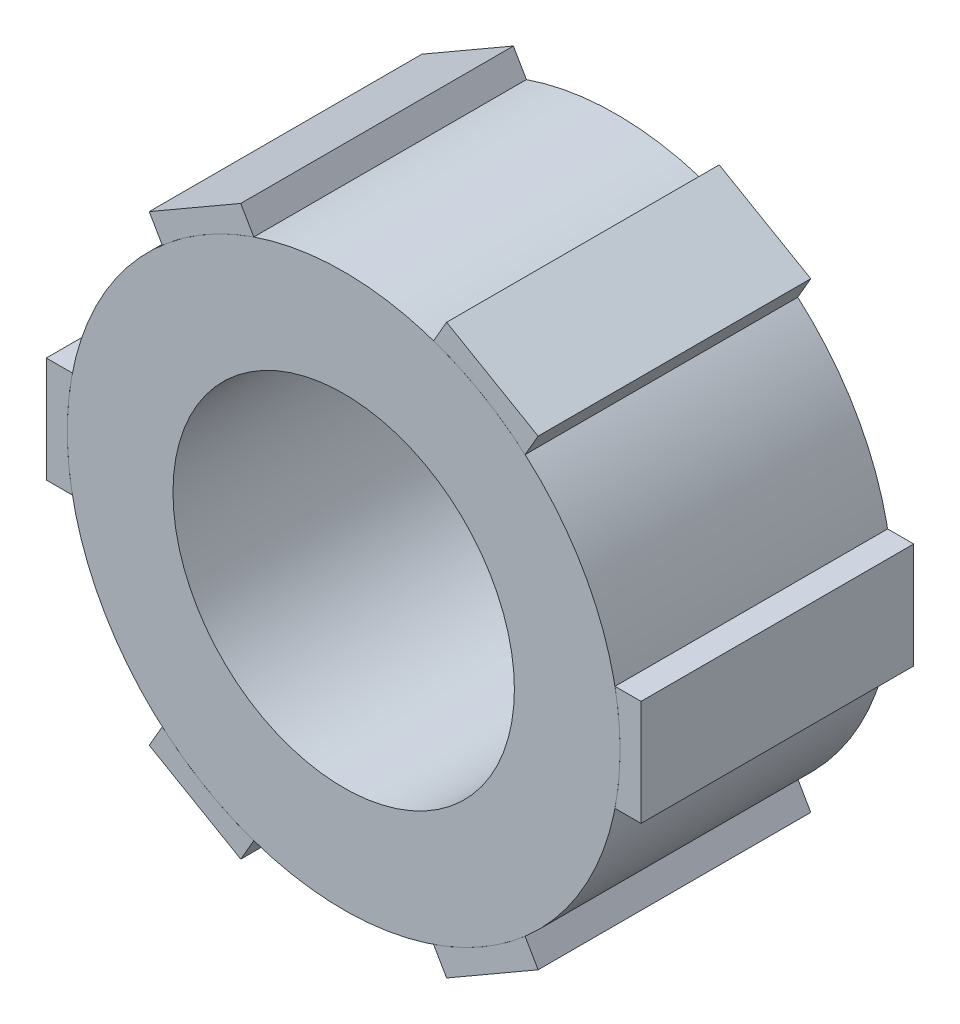
ISO-10303-21;
HEADER;
FILE_DESCRIPTION(('STEP AP214'),'2;1');
FILE_NAME('part.step','',(''),(''),'','','');
FILE_SCHEMA(('AUTOMOTIVE_DESIGN { 1 0 10303 214 1 1 1 1 }'));
ENDSEC;
DATA;
#1=APPLICATION_CONTEXT('core data for automotive mechanical design processes');
#2=APPLICATION_PROTOCOL_DEFINITION('international standard','automotive_design',2000,#1);
#3=PRODUCT_CONTEXT('',#1,'mechanical');
#4=PRODUCT('Part','Part','',(#3));
#5=PRODUCT_RELATED_PRODUCT_CATEGORY('part','',(#4));
#6=PRODUCT_DEFINITION_FORMATION('','',#4);
#7=PRODUCT_DEFINITION_CONTEXT('part definition',#1,'design');
#8=PRODUCT_DEFINITION('design','',#6,#7);
#9=PRODUCT_DEFINITION_SHAPE('','',#8);
#10=(LENGTH_UNIT() NAMED_UNIT(*) SI_UNIT(.MILLI.,.METRE.));
#11=(NAMED_UNIT(*) PLANE_ANGLE_UNIT() SI_UNIT($,.RADIAN.));
#12=(NAMED_UNIT(*) SI_UNIT($,.STERADIAN.) SOLID_ANGLE_UNIT());
#13=UNCERTAINTY_MEASURE_WITH_UNIT(LENGTH_MEASURE(1.E-05),#10,'distance_accuracy_value','');
#14=(GEOMETRIC_REPRESENTATION_CONTEXT(3) GLOBAL_UNCERTAINTY_ASSIGNED_CONTEXT((#13)) GLOBAL_UNIT_ASSIGNED_CONTEXT((#10,
#11,#12)) REPRESENTATION_CONTEXT('',''));
#15=CARTESIAN_POINT('',(0.,0.,0.));
#16=DIRECTION('',(0.,0.,1.));
#17=DIRECTION('',(1.,0.,0.));
#18=AXIS2_PLACEMENT_3D('',#15,#16,#17);
#19=CARTESIAN_POINT('',(0.,0.,-3.59829421058804));
#20=DIRECTION('',(0.,0.,1.));
#21=DIRECTION('',(1.,0.,0.));
#22=AXIS2_PLACEMENT_3D('',#19,#20,#21);
#23=CYLINDRICAL_SURFACE('',#22,7.715);
#24=DIRECTION('',(0.,0.,1.));
#25=VECTOR('',#24,1.);
#26=CARTESIAN_POINT('',(-2.50895641237421,-7.29563998020779,-3.59829421058804));
#27=LINE('',#26,#25);
#28=CARTESIAN_POINT('',(-2.50895641237421,-7.29563998020779,0.));
#29=VERTEX_POINT('',#28);
#30=CARTESIAN_POINT('',(-2.50895641237421,-7.29563998020779,7.61));
#31=VERTEX_POINT('',#30);
#32=EDGE_CURVE('E120',#29,#31,#27,.T.);
#33=ORIENTED_EDGE('',*,*,#32,.F.);
#34=CARTESIAN_POINT('',(0.,0.,0.));
#35=DIRECTION('',(0.,0.,1.));
#36=DIRECTION('',(1.,0.,0.));
#37=AXIS2_PLACEMENT_3D('',#34,#35,#36);
#38=CIRCLE('',#37,7.715);
#39=CARTESIAN_POINT('',(-5.0637313535383,-5.82063998020778,0.));
#40=VERTEX_POINT('',#39);
#41=EDGE_CURVE('E65',#29,#40,#38,.F.);
#42=ORIENTED_EDGE('',*,*,#41,.T.);
#43=DIRECTION('',(0.,0.,1.));
#44=VECTOR('',#43,1.);
#45=CARTESIAN_POINT('',(-5.0637313535383,-5.82063998020778,-3.59829421058804));
#46=LINE('',#45,#44);
#47=CARTESIAN_POINT('',(-5.0637313535383,-5.82063998020778,7.61));
#48=VERTEX_POINT('',#47);
#49=EDGE_CURVE('E95',#40,#48,#46,.T.);
#50=ORIENTED_EDGE('',*,*,#49,.T.);
#51=CARTESIAN_POINT('',(0.,0.,7.61));
#52=DIRECTION('',(0.,0.,1.));
#53=DIRECTION('',(1.,0.,0.));
#54=AXIS2_PLACEMENT_3D('',#51,#52,#53);
#55=CIRCLE('',#54,7.715);
#56=EDGE_CURVE('E98',#48,#31,#55,.T.);
#57=ORIENTED_EDGE('',*,*,#56,.T.);
#58=EDGE_LOOP('',(#33,#42,#50,#57));
#59=FACE_BOUND('',#58,.T.);
#60=ADVANCED_FACE('F58',(#59),#23,.F.);
#61=CARTESIAN_POINT('',(1.27738747058204,-0.737500000000006,-3.59829421058804));
#62=DIRECTION('',(-0.866025403784436,0.500000000000004,0.));
#63=DIRECTION('',(-0.500000000000004,-0.866025403784436,0.));
#64=AXIS2_PLACEMENT_3D('',#61,#62,#63);
#65=PLANE('',#64);
#66=DIRECTION('',(0.,0.,1.));
#67=VECTOR('',#66,1.);
#68=CARTESIAN_POINT('',(-2.87261252941799,-7.92551085141083,-3.59829421058804));
#69=LINE('',#68,#67);
#70=CARTESIAN_POINT('',(-2.87261252941799,-7.92551085141083,0.));
#71=VERTEX_POINT('',#70);
#72=CARTESIAN_POINT('',(-2.87261252941799,-7.92551085141083,7.61));
#73=VERTEX_POINT('',#72);
#74=EDGE_CURVE('E123',#71,#73,#69,.T.);
#75=ORIENTED_EDGE('',*,*,#74,.F.);
#76=DIRECTION('',(0.500000000000004,0.866025403784436,0.));
#77=VECTOR('',#76,1.);
#78=CARTESIAN_POINT('',(1.27738747058204,-0.737500000000006,0.));
#79=LINE('',#78,#77);
#80=EDGE_CURVE('E72',#71,#29,#79,.T.);
#81=ORIENTED_EDGE('',*,*,#80,.T.);
#82=ORIENTED_EDGE('',*,*,#32,.T.);
#83=DIRECTION('',(-0.500000000000004,-0.866025403784436,0.));
#84=VECTOR('',#83,1.);
#85=CARTESIAN_POINT('',(1.27738747058204,-0.737500000000006,7.61));
#86=LINE('',#85,#84);
#87=EDGE_CURVE('E102',#31,#73,#86,.T.);
#88=ORIENTED_EDGE('',*,*,#87,.T.);
#89=EDGE_LOOP('',(#75,#81,#82,#88));
#90=FACE_BOUND('',#89,.T.);
#91=ADVANCED_FACE('F129',(#90),#65,.F.);
#92=CARTESIAN_POINT('',(-4.15000000000003,-7.18801085141082,-3.59829421058804));
#93=DIRECTION('',(0.500000000000004,0.866025403784436,0.));
#94=DIRECTION('',(-0.866025403784436,0.500000000000004,0.));
#95=AXIS2_PLACEMENT_3D('',#92,#93,#94);
#96=PLANE('',#95);
#97=DIRECTION('',(0.,0.,1.));
#98=VECTOR('',#97,1.);
#99=CARTESIAN_POINT('',(-5.42738747058208,-6.45051085141082,-3.59829421058804));
#100=LINE('',#99,#98);
#101=CARTESIAN_POINT('',(-5.42738747058208,-6.45051085141082,0.));
#102=VERTEX_POINT('',#101);
#103=CARTESIAN_POINT('',(-5.42738747058208,-6.45051085141082,7.61));
#104=VERTEX_POINT('',#103);
#105=EDGE_CURVE('E101',#102,#104,#100,.T.);
#106=ORIENTED_EDGE('',*,*,#105,.F.);
#107=DIRECTION('',(0.866025403784436,-0.500000000000004,0.));
#108=VECTOR('',#107,1.);
#109=CARTESIAN_POINT('',(-4.15000000000003,-7.18801085141082,0.));
#110=LINE('',#109,#108);
#111=EDGE_CURVE('E122',#102,#71,#110,.T.);
#112=ORIENTED_EDGE('',*,*,#111,.T.);
#113=ORIENTED_EDGE('',*,*,#74,.T.);
#114=DIRECTION('',(-0.866025403784436,0.500000000000004,0.));
#115=VECTOR('',#114,1.);
#116=CARTESIAN_POINT('',(-4.15000000000003,-7.18801085141082,7.61));
#117=LINE('',#116,#115);
#118=EDGE_CURVE('E114',#73,#104,#117,.T.);
#119=ORIENTED_EDGE('',*,*,#118,.T.);
#120=EDGE_LOOP('',(#106,#112,#113,#119));
#121=FACE_BOUND('',#120,.T.);
#122=ADVANCED_FACE('F127',(#121),#96,.F.);
#123=CARTESIAN_POINT('',(-1.27738747058204,0.737500000000006,-3.59829421058804));
#124=DIRECTION('',(-0.866025403784436,0.500000000000004,0.));
#125=DIRECTION('',(-0.500000000000004,-0.866025403784436,0.));
#126=AXIS2_PLACEMENT_3D('',#123,#124,#125);
#127=PLANE('',#126);
#128=DIRECTION('',(0.500000000000004,0.866025403784436,0.));
#129=VECTOR('',#128,1.);
#130=CARTESIAN_POINT('',(-1.27738747058204,0.737500000000006,0.));
#131=LINE('',#130,#129);
#132=EDGE_CURVE('E12',#102,#40,#131,.T.);
#133=ORIENTED_EDGE('',*,*,#132,.F.);
#134=ORIENTED_EDGE('',*,*,#105,.T.);
#135=DIRECTION('',(-0.500000000000004,-0.866025403784436,0.));
#136=VECTOR('',#135,1.);
#137=CARTESIAN_POINT('',(-1.27738747058204,0.737500000000006,7.61));
#138=LINE('',#137,#136);
#139=EDGE_CURVE('E108',#48,#104,#138,.T.);
#140=ORIENTED_EDGE('',*,*,#139,.F.);
#141=ORIENTED_EDGE('',*,*,#49,.F.);
#142=EDGE_LOOP('',(#133,#134,#140,#141));
#143=FACE_BOUND('',#142,.T.);
#144=ADVANCED_FACE('F111',(#143),#127,.T.);
#145=CARTESIAN_POINT('',(0.,0.,7.61));
#146=DIRECTION('',(0.,0.,1.));
#147=DIRECTION('',(1.,0.,0.));
#148=AXIS2_PLACEMENT_3D('',#145,#146,#147);
#149=PLANE('',#148);
#150=ORIENTED_EDGE('',*,*,#56,.F.);
#151=ORIENTED_EDGE('',*,*,#139,.T.);
#152=ORIENTED_EDGE('',*,*,#118,.F.);
#153=ORIENTED_EDGE('',*,*,#87,.F.);
#154=EDGE_LOOP('',(#150,#151,#152,#153));
#155=FACE_BOUND('',#154,.T.);
#156=ADVANCED_FACE('F106',(#155),#149,.T.);
#157=CARTESIAN_POINT('',(0.,0.,0.));
#158=DIRECTION('',(0.,0.,1.));
#159=DIRECTION('',(1.,0.,0.));
#160=AXIS2_PLACEMENT_3D('',#157,#158,#159);
#161=PLANE('',#160);
#162=ORIENTED_EDGE('',*,*,#80,.F.);
#163=ORIENTED_EDGE('',*,*,#111,.F.);
#164=ORIENTED_EDGE('',*,*,#132,.T.);
#165=ORIENTED_EDGE('',*,*,#41,.F.);
#166=EDGE_LOOP('',(#162,#163,#164,#165));
#167=FACE_BOUND('',#166,.T.);
#168=ADVANCED_FACE('F145',(#167),#161,.F.);
#169=CLOSED_SHELL('',(#60,#91,#122,#144,#156,#168));
#170=MANIFOLD_SOLID_BREP('B2',#169);
#171=CARTESIAN_POINT('',(0.,0.,-3.59829421058804));
#172=DIRECTION('',(0.,0.,1.));
#173=DIRECTION('',(1.,0.,0.));
#174=AXIS2_PLACEMENT_3D('',#171,#172,#173);
#175=CYLINDRICAL_SURFACE('',#174,7.715);
#176=DIRECTION('',(0.,0.,1.));
#177=VECTOR('',#176,1.);
#178=CARTESIAN_POINT('',(5.06373135353825,-5.82063998020782,-3.59829421058804));
#179=LINE('',#178,#177);
#180=CARTESIAN_POINT('',(5.06373135353825,-5.82063998020782,0.));
#181=VERTEX_POINT('',#180);
#182=CARTESIAN_POINT('',(5.06373135353825,-5.82063998020782,7.61));
#183=VERTEX_POINT('',#182);
#184=EDGE_CURVE('E254',#181,#183,#179,.T.);
#185=ORIENTED_EDGE('',*,*,#184,.F.);
#186=CARTESIAN_POINT('',(0.,0.,0.));
#187=DIRECTION('',(0.,0.,1.));
#188=DIRECTION('',(1.,0.,0.));
#189=AXIS2_PLACEMENT_3D('',#186,#187,#188);
#190=CIRCLE('',#189,7.715);
#191=CARTESIAN_POINT('',(2.50895641237416,-7.29563998020781,0.));
#192=VERTEX_POINT('',#191);
#193=EDGE_CURVE('E199',#181,#192,#190,.F.);
#194=ORIENTED_EDGE('',*,*,#193,.T.);
#195=DIRECTION('',(0.,0.,1.));
#196=VECTOR('',#195,1.);
#197=CARTESIAN_POINT('',(2.50895641237416,-7.29563998020781,-3.59829421058804));
#198=LINE('',#197,#196);
#199=CARTESIAN_POINT('',(2.50895641237416,-7.29563998020781,7.61));
#200=VERTEX_POINT('',#199);
#201=EDGE_CURVE('E229',#192,#200,#198,.T.);
#202=ORIENTED_EDGE('',*,*,#201,.T.);
#203=CARTESIAN_POINT('',(0.,0.,7.61));
#204=DIRECTION('',(0.,0.,1.));
#205=DIRECTION('',(1.,0.,0.));
#206=AXIS2_PLACEMENT_3D('',#203,#204,#205);
#207=CIRCLE('',#206,7.715);
#208=EDGE_CURVE('E232',#200,#183,#207,.T.);
#209=ORIENTED_EDGE('',*,*,#208,.T.);
#210=EDGE_LOOP('',(#185,#194,#202,#209));
#211=FACE_BOUND('',#210,.T.);
#212=ADVANCED_FACE('F192',(#211),#175,.F.);
#213=CARTESIAN_POINT('',(1.27738747058205,0.737499999999997,-3.59829421058804));
#214=DIRECTION('',(-0.86602540378444,-0.499999999999998,0.));
#215=DIRECTION('',(0.499999999999998,-0.86602540378444,0.));
#216=AXIS2_PLACEMENT_3D('',#213,#214,#215);
#217=PLANE('',#216);
#218=DIRECTION('',(0.,0.,1.));
#219=VECTOR('',#218,1.);
#220=CARTESIAN_POINT('',(5.42738747058203,-6.45051085141085,-3.59829421058804));
#221=LINE('',#220,#219);
#222=CARTESIAN_POINT('',(5.42738747058203,-6.45051085141085,0.));
#223=VERTEX_POINT('',#222);
#224=CARTESIAN_POINT('',(5.42738747058203,-6.45051085141085,7.61));
#225=VERTEX_POINT('',#224);
#226=EDGE_CURVE('E257',#223,#225,#221,.T.);
#227=ORIENTED_EDGE('',*,*,#226,.F.);
#228=DIRECTION('',(-0.499999999999998,0.86602540378444,0.));
#229=VECTOR('',#228,1.);
#230=CARTESIAN_POINT('',(1.27738747058205,0.737499999999997,0.));
#231=LINE('',#230,#229);
#232=EDGE_CURVE('E206',#223,#181,#231,.T.);
#233=ORIENTED_EDGE('',*,*,#232,.T.);
#234=ORIENTED_EDGE('',*,*,#184,.T.);
#235=DIRECTION('',(0.499999999999998,-0.86602540378444,0.));
#236=VECTOR('',#235,1.);
#237=CARTESIAN_POINT('',(1.27738747058205,0.737499999999997,7.61));
#238=LINE('',#237,#236);
#239=EDGE_CURVE('E236',#183,#225,#238,.T.);
#240=ORIENTED_EDGE('',*,*,#239,.T.);
#241=EDGE_LOOP('',(#227,#233,#234,#240));
#242=FACE_BOUND('',#241,.T.);
#243=ADVANCED_FACE('F263',(#242),#217,.F.);
#244=CARTESIAN_POINT('',(4.14999999999998,-7.18801085141085,-3.59829421058804));
#245=DIRECTION('',(-0.499999999999998,0.86602540378444,0.));
#246=DIRECTION('',(-0.86602540378444,-0.499999999999998,0.));
#247=AXIS2_PLACEMENT_3D('',#244,#245,#246);
#248=PLANE('',#247);
#249=DIRECTION('',(0.,0.,1.));
#250=VECTOR('',#249,1.);
#251=CARTESIAN_POINT('',(2.87261252941793,-7.92551085141085,-3.59829421058804));
#252=LINE('',#251,#250);
#253=CARTESIAN_POINT('',(2.87261252941793,-7.92551085141085,0.));
#254=VERTEX_POINT('',#253);
#255=CARTESIAN_POINT('',(2.87261252941793,-7.92551085141085,7.61));
#256=VERTEX_POINT('',#255);
#257=EDGE_CURVE('E235',#254,#256,#252,.T.);
#258=ORIENTED_EDGE('',*,*,#257,.F.);
#259=DIRECTION('',(0.86602540378444,0.499999999999998,0.));
#260=VECTOR('',#259,1.);
#261=CARTESIAN_POINT('',(4.14999999999998,-7.18801085141085,0.));
#262=LINE('',#261,#260);
#263=EDGE_CURVE('E256',#254,#223,#262,.T.);
#264=ORIENTED_EDGE('',*,*,#263,.T.);
#265=ORIENTED_EDGE('',*,*,#226,.T.);
#266=DIRECTION('',(-0.86602540378444,-0.499999999999998,0.));
#267=VECTOR('',#266,1.);
#268=CARTESIAN_POINT('',(4.14999999999998,-7.18801085141085,7.61));
#269=LINE('',#268,#267);
#270=EDGE_CURVE('E248',#225,#256,#269,.T.);
#271=ORIENTED_EDGE('',*,*,#270,.T.);
#272=EDGE_LOOP('',(#258,#264,#265,#271));
#273=FACE_BOUND('',#272,.T.);
#274=ADVANCED_FACE('F261',(#273),#248,.F.);
#275=CARTESIAN_POINT('',(-1.27738747058205,-0.737499999999998,-3.59829421058804));
#276=DIRECTION('',(-0.86602540378444,-0.499999999999998,0.));
#277=DIRECTION('',(0.499999999999998,-0.86602540378444,0.));
#278=AXIS2_PLACEMENT_3D('',#275,#276,#277);
#279=PLANE('',#278);
#280=DIRECTION('',(-0.499999999999998,0.86602540378444,0.));
#281=VECTOR('',#280,1.);
#282=CARTESIAN_POINT('',(-1.27738747058205,-0.737499999999998,0.));
#283=LINE('',#282,#281);
#284=EDGE_CURVE('E56',#254,#192,#283,.T.);
#285=ORIENTED_EDGE('',*,*,#284,.F.);
#286=ORIENTED_EDGE('',*,*,#257,.T.);
#287=DIRECTION('',(0.499999999999998,-0.86602540378444,0.));
#288=VECTOR('',#287,1.);
#289=CARTESIAN_POINT('',(-1.27738747058205,-0.737499999999998,7.61));
#290=LINE('',#289,#288);
#291=EDGE_CURVE('E242',#200,#256,#290,.T.);
#292=ORIENTED_EDGE('',*,*,#291,.F.);
#293=ORIENTED_EDGE('',*,*,#201,.F.);
#294=EDGE_LOOP('',(#285,#286,#292,#293));
#295=FACE_BOUND('',#294,.T.);
#296=ADVANCED_FACE('F245',(#295),#279,.T.);
#297=CARTESIAN_POINT('',(0.,0.,7.61));
#298=DIRECTION('',(0.,0.,1.));
#299=DIRECTION('',(1.,0.,0.));
#300=AXIS2_PLACEMENT_3D('',#297,#298,#299);
#301=PLANE('',#300);
#302=ORIENTED_EDGE('',*,*,#208,.F.);
#303=ORIENTED_EDGE('',*,*,#291,.T.);
#304=ORIENTED_EDGE('',*,*,#270,.F.);
#305=ORIENTED_EDGE('',*,*,#239,.F.);
#306=EDGE_LOOP('',(#302,#303,#304,#305));
#307=FACE_BOUND('',#306,.T.);
#308=ADVANCED_FACE('F240',(#307),#301,.T.);
#309=CARTESIAN_POINT('',(0.,0.,0.));
#310=DIRECTION('',(0.,0.,1.));
#311=DIRECTION('',(1.,0.,0.));
#312=AXIS2_PLACEMENT_3D('',#309,#310,#311);
#313=PLANE('',#312);
#314=ORIENTED_EDGE('',*,*,#232,.F.);
#315=ORIENTED_EDGE('',*,*,#263,.F.);
#316=ORIENTED_EDGE('',*,*,#284,.T.);
#317=ORIENTED_EDGE('',*,*,#193,.F.);
#318=EDGE_LOOP('',(#314,#315,#316,#317));
#319=FACE_BOUND('',#318,.T.);
#320=ADVANCED_FACE('F279',(#319),#313,.F.);
#321=CLOSED_SHELL('',(#212,#243,#274,#296,#308,#320));
#322=MANIFOLD_SOLID_BREP('B6',#321);
#323=CARTESIAN_POINT('',(0.,0.,7.61));
#324=DIRECTION('',(0.,0.,1.));
#325=DIRECTION('',(1.,0.,0.));
#326=AXIS2_PLACEMENT_3D('',#323,#324,#325);
#327=PLANE('',#326);
#328=DIRECTION('',(0.,-1.,0.));
#329=VECTOR('',#328,1.);
#330=CARTESIAN_POINT('',(8.3,0.,7.61));
#331=LINE('',#330,#329);
#332=CARTESIAN_POINT('',(8.3,1.475,7.61));
#333=VERTEX_POINT('',#332);
#334=CARTESIAN_POINT('',(8.3,-1.475,7.61));
#335=VERTEX_POINT('',#334);
#336=EDGE_CURVE('E369',#333,#335,#331,.T.);
#337=ORIENTED_EDGE('',*,*,#336,.F.);
#338=DIRECTION('',(1.,0.,0.));
#339=VECTOR('',#338,1.);
#340=CARTESIAN_POINT('',(0.,1.475,7.61));
#341=LINE('',#340,#339);
#342=CARTESIAN_POINT('',(7.57268776591244,1.475,7.61));
#343=VERTEX_POINT('',#342);
#344=EDGE_CURVE('E375',#343,#333,#341,.T.);
#345=ORIENTED_EDGE('',*,*,#344,.F.);
#346=CARTESIAN_POINT('',(0.,0.,7.61));
#347=DIRECTION('',(0.,0.,1.));
#348=DIRECTION('',(1.,0.,0.));
#349=AXIS2_PLACEMENT_3D('',#346,#347,#348);
#350=CIRCLE('',#349,7.715);
#351=CARTESIAN_POINT('',(7.57268776591244,-1.475,7.61));
#352=VERTEX_POINT('',#351);
#353=EDGE_CURVE('E381',#352,#343,#350,.T.);
#354=ORIENTED_EDGE('',*,*,#353,.F.);
#355=DIRECTION('',(1.,0.,0.));
#356=VECTOR('',#355,1.);
#357=CARTESIAN_POINT('',(0.,-1.475,7.61));
#358=LINE('',#357,#356);
#359=EDGE_CURVE('E373',#352,#335,#358,.T.);
#360=ORIENTED_EDGE('',*,*,#359,.T.);
#361=EDGE_LOOP('',(#337,#345,#354,#360));
#362=FACE_BOUND('',#361,.T.);
#363=ADVANCED_FACE('F326',(#362),#327,.T.);
#364=CARTESIAN_POINT('',(0.,1.475,-3.59829421058804));
#365=DIRECTION('',(0.,-1.,0.));
#366=DIRECTION('',(0.,0.,-1.));
#367=AXIS2_PLACEMENT_3D('',#364,#365,#366);
#368=PLANE('',#367);
#369=DIRECTION('',(0.,0.,1.));
#370=VECTOR('',#369,1.);
#371=CARTESIAN_POINT('',(8.3,1.475,-3.59829421058804));
#372=LINE('',#371,#370);
#373=CARTESIAN_POINT('',(8.3,1.475,0.));
#374=VERTEX_POINT('',#373);
#375=EDGE_CURVE('E365',#374,#333,#372,.T.);
#376=ORIENTED_EDGE('',*,*,#375,.F.);
#377=DIRECTION('',(-1.,0.,0.));
#378=VECTOR('',#377,1.);
#379=CARTESIAN_POINT('',(0.,1.475,0.));
#380=LINE('',#379,#378);
#381=CARTESIAN_POINT('',(7.57268776591244,1.475,0.));
#382=VERTEX_POINT('',#381);
#383=EDGE_CURVE('E330',#374,#382,#380,.T.);
#384=ORIENTED_EDGE('',*,*,#383,.T.);
#385=DIRECTION('',(0.,0.,1.));
#386=VECTOR('',#385,1.);
#387=CARTESIAN_POINT('',(7.57268776591244,1.475,-3.59829421058804));
#388=LINE('',#387,#386);
#389=EDGE_CURVE('E372',#382,#343,#388,.T.);
#390=ORIENTED_EDGE('',*,*,#389,.T.);
#391=ORIENTED_EDGE('',*,*,#344,.T.);
#392=EDGE_LOOP('',(#376,#384,#390,#391));
#393=FACE_BOUND('',#392,.T.);
#394=ADVANCED_FACE('F376',(#393),#368,.F.);
#395=CARTESIAN_POINT('',(0.,0.,-3.59829421058804));
#396=DIRECTION('',(0.,0.,1.));
#397=DIRECTION('',(1.,0.,0.));
#398=AXIS2_PLACEMENT_3D('',#395,#396,#397);
#399=CYLINDRICAL_SURFACE('',#398,7.715);
#400=ORIENTED_EDGE('',*,*,#389,.F.);
#401=CARTESIAN_POINT('',(0.,0.,0.));
#402=DIRECTION('',(0.,0.,1.));
#403=DIRECTION('',(1.,0.,0.));
#404=AXIS2_PLACEMENT_3D('',#401,#402,#403);
#405=CIRCLE('',#404,7.715);
#406=CARTESIAN_POINT('',(7.57268776591244,-1.475,0.));
#407=VERTEX_POINT('',#406);
#408=EDGE_CURVE('E396',#382,#407,#405,.F.);
#409=ORIENTED_EDGE('',*,*,#408,.T.);
#410=DIRECTION('',(0.,0.,1.));
#411=VECTOR('',#410,1.);
#412=CARTESIAN_POINT('',(7.57268776591244,-1.475,-3.59829421058804));
#413=LINE('',#412,#411);
#414=EDGE_CURVE('E391',#407,#352,#413,.T.);
#415=ORIENTED_EDGE('',*,*,#414,.T.);
#416=ORIENTED_EDGE('',*,*,#353,.T.);
#417=EDGE_LOOP('',(#400,#409,#415,#416));
#418=FACE_BOUND('',#417,.T.);
#419=ADVANCED_FACE('F395',(#418),#399,.F.);
#420=CARTESIAN_POINT('',(0.,-1.475,-3.59829421058804));
#421=DIRECTION('',(0.,-1.,0.));
#422=DIRECTION('',(0.,0.,-1.));
#423=AXIS2_PLACEMENT_3D('',#420,#421,#422);
#424=PLANE('',#423);
#425=DIRECTION('',(-1.,0.,0.));
#426=VECTOR('',#425,1.);
#427=CARTESIAN_POINT('',(0.,-1.475,0.));
#428=LINE('',#427,#426);
#429=CARTESIAN_POINT('',(8.3,-1.475,0.));
#430=VERTEX_POINT('',#429);
#431=EDGE_CURVE('E335',#430,#407,#428,.T.);
#432=ORIENTED_EDGE('',*,*,#431,.F.);
#433=DIRECTION('',(0.,0.,1.));
#434=VECTOR('',#433,1.);
#435=CARTESIAN_POINT('',(8.3,-1.475,-3.59829421058804));
#436=LINE('',#435,#434);
#437=EDGE_CURVE('E389',#430,#335,#436,.T.);
#438=ORIENTED_EDGE('',*,*,#437,.T.);
#439=ORIENTED_EDGE('',*,*,#359,.F.);
#440=ORIENTED_EDGE('',*,*,#414,.F.);
#441=EDGE_LOOP('',(#432,#438,#439,#440));
#442=FACE_BOUND('',#441,.T.);
#443=ADVANCED_FACE('F398',(#442),#424,.T.);
#444=CARTESIAN_POINT('',(8.3,0.,-3.59829421058804));
#445=DIRECTION('',(-1.,0.,0.));
#446=DIRECTION('',(0.,0.,1.));
#447=AXIS2_PLACEMENT_3D('',#444,#445,#446);
#448=PLANE('',#447);
#449=ORIENTED_EDGE('',*,*,#437,.F.);
#450=DIRECTION('',(0.,1.,0.));
#451=VECTOR('',#450,1.);
#452=CARTESIAN_POINT('',(8.3,0.,0.));
#453=LINE('',#452,#451);
#454=EDGE_CURVE('E190',#430,#374,#453,.T.);
#455=ORIENTED_EDGE('',*,*,#454,.T.);
#456=ORIENTED_EDGE('',*,*,#375,.T.);
#457=ORIENTED_EDGE('',*,*,#336,.T.);
#458=EDGE_LOOP('',(#449,#455,#456,#457));
#459=FACE_BOUND('',#458,.T.);
#460=ADVANCED_FACE('F328',(#459),#448,.F.);
#461=CARTESIAN_POINT('',(0.,0.,0.));
#462=DIRECTION('',(0.,0.,1.));
#463=DIRECTION('',(1.,0.,0.));
#464=AXIS2_PLACEMENT_3D('',#461,#462,#463);
#465=PLANE('',#464);
#466=ORIENTED_EDGE('',*,*,#431,.T.);
#467=ORIENTED_EDGE('',*,*,#408,.F.);
#468=ORIENTED_EDGE('',*,*,#383,.F.);
#469=ORIENTED_EDGE('',*,*,#454,.F.);
#470=EDGE_LOOP('',(#466,#467,#468,#469));
#471=FACE_BOUND('',#470,.T.);
#472=ADVANCED_FACE('F406',(#471),#465,.F.);
#473=CLOSED_SHELL('',(#363,#394,#419,#443,#460,#472));
#474=MANIFOLD_SOLID_BREP('B50',#473);
#475=CARTESIAN_POINT('',(4.15000000000003,7.18801085141082,-3.59829421058804));
#476=DIRECTION('',(0.500000000000004,0.866025403784436,0.));
#477=DIRECTION('',(-0.866025403784436,0.500000000000004,0.));
#478=AXIS2_PLACEMENT_3D('',#475,#476,#477);
#479=PLANE('',#478);
#480=DIRECTION('',(0.866025403784436,-0.500000000000004,0.));
#481=VECTOR('',#480,1.);
#482=CARTESIAN_POINT('',(4.15000000000003,7.18801085141082,0.));
#483=LINE('',#482,#481);
#484=CARTESIAN_POINT('',(2.87261252941799,7.92551085141083,0.));
#485=VERTEX_POINT('',#484);
#486=CARTESIAN_POINT('',(5.42738747058208,6.45051085141082,0.));
#487=VERTEX_POINT('',#486);
#488=EDGE_CURVE('E476',#485,#487,#483,.T.);
#489=ORIENTED_EDGE('',*,*,#488,.F.);
#490=DIRECTION('',(0.,0.,1.));
#491=VECTOR('',#490,1.);
#492=CARTESIAN_POINT('',(2.87261252941799,7.92551085141083,-3.59829421058804));
#493=LINE('',#492,#491);
#494=CARTESIAN_POINT('',(2.87261252941799,7.92551085141083,7.61));
#495=VERTEX_POINT('',#494);
#496=EDGE_CURVE('E505',#485,#495,#493,.T.);
#497=ORIENTED_EDGE('',*,*,#496,.T.);
#498=DIRECTION('',(-0.866025403784436,0.500000000000004,0.));
#499=VECTOR('',#498,1.);
#500=CARTESIAN_POINT('',(4.15000000000003,7.18801085141082,7.61));
#501=LINE('',#500,#499);
#502=CARTESIAN_POINT('',(5.42738747058208,6.45051085141082,7.61));
#503=VERTEX_POINT('',#502);
#504=EDGE_CURVE('E509',#503,#495,#501,.T.);
#505=ORIENTED_EDGE('',*,*,#504,.F.);
#506=DIRECTION('',(0.,0.,1.));
#507=VECTOR('',#506,1.);
#508=CARTESIAN_POINT('',(5.42738747058208,6.45051085141082,-3.59829421058804));
#509=LINE('',#508,#507);
#510=EDGE_CURVE('E532',#487,#503,#509,.T.);
#511=ORIENTED_EDGE('',*,*,#510,.F.);
#512=EDGE_LOOP('',(#489,#497,#505,#511));
#513=FACE_BOUND('',#512,.T.);
#514=ADVANCED_FACE('F469',(#513),#479,.T.);
#515=CARTESIAN_POINT('',(1.27738747058204,-0.737500000000006,-3.59829421058804));
#516=DIRECTION('',(-0.866025403784436,0.500000000000004,0.));
#517=DIRECTION('',(-0.500000000000004,-0.866025403784436,0.));
#518=AXIS2_PLACEMENT_3D('',#515,#516,#517);
#519=PLANE('',#518);
#520=DIRECTION('',(0.,0.,1.));
#521=VECTOR('',#520,1.);
#522=CARTESIAN_POINT('',(5.0637313535383,5.82063998020778,-3.59829421058804));
#523=LINE('',#522,#521);
#524=CARTESIAN_POINT('',(5.0637313535383,5.82063998020778,0.));
#525=VERTEX_POINT('',#524);
#526=CARTESIAN_POINT('',(5.0637313535383,5.82063998020778,7.61));
#527=VERTEX_POINT('',#526);
#528=EDGE_CURVE('E535',#525,#527,#523,.T.);
#529=ORIENTED_EDGE('',*,*,#528,.F.);
#530=DIRECTION('',(0.500000000000004,0.866025403784436,0.));
#531=VECTOR('',#530,1.);
#532=CARTESIAN_POINT('',(1.27738747058204,-0.737500000000006,0.));
#533=LINE('',#532,#531);
#534=EDGE_CURVE('E483',#525,#487,#533,.T.);
#535=ORIENTED_EDGE('',*,*,#534,.T.);
#536=ORIENTED_EDGE('',*,*,#510,.T.);
#537=DIRECTION('',(-0.500000000000004,-0.866025403784436,0.));
#538=VECTOR('',#537,1.);
#539=CARTESIAN_POINT('',(1.27738747058204,-0.737500000000006,7.61));
#540=LINE('',#539,#538);
#541=EDGE_CURVE('E513',#503,#527,#540,.T.);
#542=ORIENTED_EDGE('',*,*,#541,.T.);
#543=EDGE_LOOP('',(#529,#535,#536,#542));
#544=FACE_BOUND('',#543,.T.);
#545=ADVANCED_FACE('F541',(#544),#519,.F.);
#546=CARTESIAN_POINT('',(0.,0.,-3.59829421058804));
#547=DIRECTION('',(0.,0.,1.));
#548=DIRECTION('',(1.,0.,0.));
#549=AXIS2_PLACEMENT_3D('',#546,#547,#548);
#550=CYLINDRICAL_SURFACE('',#549,7.715);
#551=DIRECTION('',(0.,0.,1.));
#552=VECTOR('',#551,1.);
#553=CARTESIAN_POINT('',(2.50895641237421,7.29563998020779,-3.59829421058804));
#554=LINE('',#553,#552);
#555=CARTESIAN_POINT('',(2.50895641237421,7.29563998020779,0.));
#556=VERTEX_POINT('',#555);
#557=CARTESIAN_POINT('',(2.50895641237421,7.29563998020779,7.61));
#558=VERTEX_POINT('',#557);
#559=EDGE_CURVE('E512',#556,#558,#554,.T.);
#560=ORIENTED_EDGE('',*,*,#559,.F.);
#561=CARTESIAN_POINT('',(0.,0.,0.));
#562=DIRECTION('',(0.,0.,1.));
#563=DIRECTION('',(1.,0.,0.));
#564=AXIS2_PLACEMENT_3D('',#561,#562,#563);
#565=CIRCLE('',#564,7.715);
#566=EDGE_CURVE('E534',#556,#525,#565,.F.);
#567=ORIENTED_EDGE('',*,*,#566,.T.);
#568=ORIENTED_EDGE('',*,*,#528,.T.);
#569=CARTESIAN_POINT('',(0.,0.,7.61));
#570=DIRECTION('',(0.,0.,1.));
#571=DIRECTION('',(1.,0.,0.));
#572=AXIS2_PLACEMENT_3D('',#569,#570,#571);
#573=CIRCLE('',#572,7.715);
#574=EDGE_CURVE('E521',#527,#558,#573,.T.);
#575=ORIENTED_EDGE('',*,*,#574,.T.);
#576=EDGE_LOOP('',(#560,#567,#568,#575));
#577=FACE_BOUND('',#576,.T.);
#578=ADVANCED_FACE('F539',(#577),#550,.F.);
#579=CARTESIAN_POINT('',(-1.27738747058204,0.737500000000006,-3.59829421058804));
#580=DIRECTION('',(-0.866025403784436,0.500000000000004,0.));
#581=DIRECTION('',(-0.500000000000004,-0.866025403784436,0.));
#582=AXIS2_PLACEMENT_3D('',#579,#580,#581);
#583=PLANE('',#582);
#584=DIRECTION('',(0.500000000000004,0.866025403784436,0.));
#585=VECTOR('',#584,1.);
#586=CARTESIAN_POINT('',(-1.27738747058204,0.737500000000006,0.));
#587=LINE('',#586,#585);
#588=EDGE_CURVE('E324',#556,#485,#587,.T.);
#589=ORIENTED_EDGE('',*,*,#588,.F.);
#590=ORIENTED_EDGE('',*,*,#559,.T.);
#591=DIRECTION('',(-0.500000000000004,-0.866025403784436,0.));
#592=VECTOR('',#591,1.);
#593=CARTESIAN_POINT('',(-1.27738747058204,0.737500000000006,7.61));
#594=LINE('',#593,#592);
#595=EDGE_CURVE('E515',#495,#558,#594,.T.);
#596=ORIENTED_EDGE('',*,*,#595,.F.);
#597=ORIENTED_EDGE('',*,*,#496,.F.);
#598=EDGE_LOOP('',(#589,#590,#596,#597));
#599=FACE_BOUND('',#598,.T.);
#600=ADVANCED_FACE('F516',(#599),#583,.T.);
#601=CARTESIAN_POINT('',(0.,0.,7.61));
#602=DIRECTION('',(0.,0.,1.));
#603=DIRECTION('',(1.,0.,0.));
#604=AXIS2_PLACEMENT_3D('',#601,#602,#603);
#605=PLANE('',#604);
#606=ORIENTED_EDGE('',*,*,#504,.T.);
#607=ORIENTED_EDGE('',*,*,#595,.T.);
#608=ORIENTED_EDGE('',*,*,#574,.F.);
#609=ORIENTED_EDGE('',*,*,#541,.F.);
#610=EDGE_LOOP('',(#606,#607,#608,#609));
#611=FACE_BOUND('',#610,.T.);
#612=ADVANCED_FACE('F524',(#611),#605,.T.);
#613=CARTESIAN_POINT('',(0.,0.,0.));
#614=DIRECTION('',(0.,0.,1.));
#615=DIRECTION('',(1.,0.,0.));
#616=AXIS2_PLACEMENT_3D('',#613,#614,#615);
#617=PLANE('',#616);
#618=ORIENTED_EDGE('',*,*,#488,.T.);
#619=ORIENTED_EDGE('',*,*,#534,.F.);
#620=ORIENTED_EDGE('',*,*,#566,.F.);
#621=ORIENTED_EDGE('',*,*,#588,.T.);
#622=EDGE_LOOP('',(#618,#619,#620,#621));
#623=FACE_BOUND('',#622,.T.);
#624=ADVANCED_FACE('F556',(#623),#617,.F.);
#625=CLOSED_SHELL('',(#514,#545,#578,#600,#612,#624));
#626=MANIFOLD_SOLID_BREP('B184',#625);
#627=CARTESIAN_POINT('',(-4.14999999999999,7.18801085141085,-3.59829421058804));
#628=DIRECTION('',(-0.499999999999998,0.86602540378444,0.));
#629=DIRECTION('',(-0.86602540378444,-0.499999999999998,0.));
#630=AXIS2_PLACEMENT_3D('',#627,#628,#629);
#631=PLANE('',#630);
#632=DIRECTION('',(0.86602540378444,0.499999999999998,0.));
#633=VECTOR('',#632,1.);
#634=CARTESIAN_POINT('',(-4.14999999999999,7.18801085141085,0.));
#635=LINE('',#634,#633);
#636=CARTESIAN_POINT('',(-5.42738747058203,6.45051085141085,0.));
#637=VERTEX_POINT('',#636);
#638=CARTESIAN_POINT('',(-2.87261252941793,7.92551085141085,0.));
#639=VERTEX_POINT('',#638);
#640=EDGE_CURVE('E610',#637,#639,#635,.T.);
#641=ORIENTED_EDGE('',*,*,#640,.F.);
#642=DIRECTION('',(0.,0.,1.));
#643=VECTOR('',#642,1.);
#644=CARTESIAN_POINT('',(-5.42738747058203,6.45051085141086,-3.59829421058804));
#645=LINE('',#644,#643);
#646=CARTESIAN_POINT('',(-5.42738747058203,6.45051085141086,7.61));
#647=VERTEX_POINT('',#646);
#648=EDGE_CURVE('E639',#637,#647,#645,.T.);
#649=ORIENTED_EDGE('',*,*,#648,.T.);
#650=DIRECTION('',(-0.86602540378444,-0.499999999999998,0.));
#651=VECTOR('',#650,1.);
#652=CARTESIAN_POINT('',(-4.14999999999999,7.18801085141085,7.61));
#653=LINE('',#652,#651);
#654=CARTESIAN_POINT('',(-2.87261252941793,7.92551085141085,7.61));
#655=VERTEX_POINT('',#654);
#656=EDGE_CURVE('E643',#655,#647,#653,.T.);
#657=ORIENTED_EDGE('',*,*,#656,.F.);
#658=DIRECTION('',(0.,0.,1.));
#659=VECTOR('',#658,1.);
#660=CARTESIAN_POINT('',(-2.87261252941793,7.92551085141085,-3.59829421058804));
#661=LINE('',#660,#659);
#662=EDGE_CURVE('E666',#639,#655,#661,.T.);
#663=ORIENTED_EDGE('',*,*,#662,.F.);
#664=EDGE_LOOP('',(#641,#649,#657,#663));
#665=FACE_BOUND('',#664,.T.);
#666=ADVANCED_FACE('F603',(#665),#631,.T.);
#667=CARTESIAN_POINT('',(1.27738747058205,0.737499999999997,-3.59829421058804));
#668=DIRECTION('',(-0.86602540378444,-0.499999999999998,0.));
#669=DIRECTION('',(0.499999999999998,-0.86602540378444,0.));
#670=AXIS2_PLACEMENT_3D('',#667,#668,#669);
#671=PLANE('',#670);
#672=DIRECTION('',(0.,0.,1.));
#673=VECTOR('',#672,1.);
#674=CARTESIAN_POINT('',(-2.50895641237416,7.29563998020781,-3.59829421058804));
#675=LINE('',#674,#673);
#676=CARTESIAN_POINT('',(-2.50895641237416,7.29563998020781,0.));
#677=VERTEX_POINT('',#676);
#678=CARTESIAN_POINT('',(-2.50895641237416,7.29563998020781,7.61));
#679=VERTEX_POINT('',#678);
#680=EDGE_CURVE('E669',#677,#679,#675,.T.);
#681=ORIENTED_EDGE('',*,*,#680,.F.);
#682=DIRECTION('',(-0.499999999999998,0.86602540378444,0.));
#683=VECTOR('',#682,1.);
#684=CARTESIAN_POINT('',(1.27738747058205,0.737499999999997,0.));
#685=LINE('',#684,#683);
#686=EDGE_CURVE('E617',#677,#639,#685,.T.);
#687=ORIENTED_EDGE('',*,*,#686,.T.);
#688=ORIENTED_EDGE('',*,*,#662,.T.);
#689=DIRECTION('',(0.499999999999998,-0.86602540378444,0.));
#690=VECTOR('',#689,1.);
#691=CARTESIAN_POINT('',(1.27738747058205,0.737499999999997,7.61));
#692=LINE('',#691,#690);
#693=EDGE_CURVE('E647',#655,#679,#692,.T.);
#694=ORIENTED_EDGE('',*,*,#693,.T.);
#695=EDGE_LOOP('',(#681,#687,#688,#694));
#696=FACE_BOUND('',#695,.T.);
#697=ADVANCED_FACE('F675',(#696),#671,.F.);
#698=CARTESIAN_POINT('',(0.,0.,-3.59829421058804));
#699=DIRECTION('',(0.,0.,1.));
#700=DIRECTION('',(1.,0.,0.));
#701=AXIS2_PLACEMENT_3D('',#698,#699,#700);
#702=CYLINDRICAL_SURFACE('',#701,7.715);
#703=DIRECTION('',(0.,0.,1.));
#704=VECTOR('',#703,1.);
#705=CARTESIAN_POINT('',(-5.06373135353826,5.82063998020781,-3.59829421058804));
#706=LINE('',#705,#704);
#707=CARTESIAN_POINT('',(-5.06373135353826,5.82063998020781,0.));
#708=VERTEX_POINT('',#707);
#709=CARTESIAN_POINT('',(-5.06373135353826,5.82063998020781,7.61));
#710=VERTEX_POINT('',#709);
#711=EDGE_CURVE('E646',#708,#710,#706,.T.);
#712=ORIENTED_EDGE('',*,*,#711,.F.);
#713=CARTESIAN_POINT('',(0.,0.,0.));
#714=DIRECTION('',(0.,0.,1.));
#715=DIRECTION('',(1.,0.,0.));
#716=AXIS2_PLACEMENT_3D('',#713,#714,#715);
#717=CIRCLE('',#716,7.715);
#718=EDGE_CURVE('E668',#708,#677,#717,.F.);
#719=ORIENTED_EDGE('',*,*,#718,.T.);
#720=ORIENTED_EDGE('',*,*,#680,.T.);
#721=CARTESIAN_POINT('',(0.,0.,7.61));
#722=DIRECTION('',(0.,0.,1.));
#723=DIRECTION('',(1.,0.,0.));
#724=AXIS2_PLACEMENT_3D('',#721,#722,#723);
#725=CIRCLE('',#724,7.715);
#726=EDGE_CURVE('E655',#679,#710,#725,.T.);
#727=ORIENTED_EDGE('',*,*,#726,.T.);
#728=EDGE_LOOP('',(#712,#719,#720,#727));
#729=FACE_BOUND('',#728,.T.);
#730=ADVANCED_FACE('F673',(#729),#702,.F.);
#731=CARTESIAN_POINT('',(-1.27738747058205,-0.737499999999998,-3.59829421058804));
#732=DIRECTION('',(-0.86602540378444,-0.499999999999998,0.));
#733=DIRECTION('',(0.499999999999998,-0.86602540378444,0.));
#734=AXIS2_PLACEMENT_3D('',#731,#732,#733);
#735=PLANE('',#734);
#736=DIRECTION('',(-0.499999999999998,0.86602540378444,0.));
#737=VECTOR('',#736,1.);
#738=CARTESIAN_POINT('',(-1.27738747058205,-0.737499999999998,0.));
#739=LINE('',#738,#737);
#740=EDGE_CURVE('E467',#708,#637,#739,.T.);
#741=ORIENTED_EDGE('',*,*,#740,.F.);
#742=ORIENTED_EDGE('',*,*,#711,.T.);
#743=DIRECTION('',(0.499999999999998,-0.86602540378444,0.));
#744=VECTOR('',#743,1.);
#745=CARTESIAN_POINT('',(-1.27738747058205,-0.737499999999998,7.61));
#746=LINE('',#745,#744);
#747=EDGE_CURVE('E649',#647,#710,#746,.T.);
#748=ORIENTED_EDGE('',*,*,#747,.F.);
#749=ORIENTED_EDGE('',*,*,#648,.F.);
#750=EDGE_LOOP('',(#741,#742,#748,#749));
#751=FACE_BOUND('',#750,.T.);
#752=ADVANCED_FACE('F650',(#751),#735,.T.);
#753=CARTESIAN_POINT('',(0.,0.,7.61));
#754=DIRECTION('',(0.,0.,1.));
#755=DIRECTION('',(1.,0.,0.));
#756=AXIS2_PLACEMENT_3D('',#753,#754,#755);
#757=PLANE('',#756);
#758=ORIENTED_EDGE('',*,*,#656,.T.);
#759=ORIENTED_EDGE('',*,*,#747,.T.);
#760=ORIENTED_EDGE('',*,*,#726,.F.);
#761=ORIENTED_EDGE('',*,*,#693,.F.);
#762=EDGE_LOOP('',(#758,#759,#760,#761));
#763=FACE_BOUND('',#762,.T.);
#764=ADVANCED_FACE('F658',(#763),#757,.T.);
#765=CARTESIAN_POINT('',(0.,0.,0.));
#766=DIRECTION('',(0.,0.,1.));
#767=DIRECTION('',(1.,0.,0.));
#768=AXIS2_PLACEMENT_3D('',#765,#766,#767);
#769=PLANE('',#768);
#770=ORIENTED_EDGE('',*,*,#640,.T.);
#771=ORIENTED_EDGE('',*,*,#686,.F.);
#772=ORIENTED_EDGE('',*,*,#718,.F.);
#773=ORIENTED_EDGE('',*,*,#740,.T.);
#774=EDGE_LOOP('',(#770,#771,#772,#773));
#775=FACE_BOUND('',#774,.T.);
#776=ADVANCED_FACE('F690',(#775),#769,.F.);
#777=CLOSED_SHELL('',(#666,#697,#730,#752,#764,#776));
#778=MANIFOLD_SOLID_BREP('B318',#777);
#779=CARTESIAN_POINT('',(-8.3,0.,-3.59829421058804));
#780=DIRECTION('',(-1.,0.,0.));
#781=DIRECTION('',(0.,0.,1.));
#782=AXIS2_PLACEMENT_3D('',#779,#780,#781);
#783=PLANE('',#782);
#784=DIRECTION('',(0.,1.,0.));
#785=VECTOR('',#784,1.);
#786=CARTESIAN_POINT('',(-8.3,0.,0.));
#787=LINE('',#786,#785);
#788=CARTESIAN_POINT('',(-8.3,-1.475,0.));
#789=VERTEX_POINT('',#788);
#790=CARTESIAN_POINT('',(-8.3,1.475,0.));
#791=VERTEX_POINT('',#790);
#792=EDGE_CURVE('E741',#789,#791,#787,.T.);
#793=ORIENTED_EDGE('',*,*,#792,.F.);
#794=DIRECTION('',(0.,0.,1.));
#795=VECTOR('',#794,1.);
#796=CARTESIAN_POINT('',(-8.3,-1.475,-3.59829421058804));
#797=LINE('',#796,#795);
#798=CARTESIAN_POINT('',(-8.3,-1.475,7.61));
#799=VERTEX_POINT('',#798);
#800=EDGE_CURVE('E770',#789,#799,#797,.T.);
#801=ORIENTED_EDGE('',*,*,#800,.T.);
#802=DIRECTION('',(0.,-1.,0.));
#803=VECTOR('',#802,1.);
#804=CARTESIAN_POINT('',(-8.3,0.,7.61));
#805=LINE('',#804,#803);
#806=CARTESIAN_POINT('',(-8.3,1.475,7.61));
#807=VERTEX_POINT('',#806);
#808=EDGE_CURVE('E774',#807,#799,#805,.T.);
#809=ORIENTED_EDGE('',*,*,#808,.F.);
#810=DIRECTION('',(0.,0.,1.));
#811=VECTOR('',#810,1.);
#812=CARTESIAN_POINT('',(-8.3,1.475,-3.59829421058804));
#813=LINE('',#812,#811);
#814=EDGE_CURVE('E797',#791,#807,#813,.T.);
#815=ORIENTED_EDGE('',*,*,#814,.F.);
#816=EDGE_LOOP('',(#793,#801,#809,#815));
#817=FACE_BOUND('',#816,.T.);
#818=ADVANCED_FACE('F734',(#817),#783,.T.);
#819=CARTESIAN_POINT('',(0.,1.475,-3.59829421058804));
#820=DIRECTION('',(0.,-1.,0.));
#821=DIRECTION('',(0.,0.,-1.));
#822=AXIS2_PLACEMENT_3D('',#819,#820,#821);
#823=PLANE('',#822);
#824=DIRECTION('',(0.,0.,1.));
#825=VECTOR('',#824,1.);
#826=CARTESIAN_POINT('',(-7.57268776591244,1.475,-3.59829421058804));
#827=LINE('',#826,#825);
#828=CARTESIAN_POINT('',(-7.57268776591244,1.475,0.));
#829=VERTEX_POINT('',#828);
#830=CARTESIAN_POINT('',(-7.57268776591244,1.475,7.61));
#831=VERTEX_POINT('',#830);
#832=EDGE_CURVE('E800',#829,#831,#827,.T.);
#833=ORIENTED_EDGE('',*,*,#832,.F.);
#834=DIRECTION('',(-1.,0.,0.));
#835=VECTOR('',#834,1.);
#836=CARTESIAN_POINT('',(0.,1.475,0.));
#837=LINE('',#836,#835);
#838=EDGE_CURVE('E748',#829,#791,#837,.T.);
#839=ORIENTED_EDGE('',*,*,#838,.T.);
#840=ORIENTED_EDGE('',*,*,#814,.T.);
#841=DIRECTION('',(1.,0.,0.));
#842=VECTOR('',#841,1.);
#843=CARTESIAN_POINT('',(0.,1.475,7.61));
#844=LINE('',#843,#842);
#845=EDGE_CURVE('E778',#807,#831,#844,.T.);
#846=ORIENTED_EDGE('',*,*,#845,.T.);
#847=EDGE_LOOP('',(#833,#839,#840,#846));
#848=FACE_BOUND('',#847,.T.);
#849=ADVANCED_FACE('F806',(#848),#823,.F.);
#850=CARTESIAN_POINT('',(0.,0.,-3.59829421058804));
#851=DIRECTION('',(0.,0.,1.));
#852=DIRECTION('',(1.,0.,0.));
#853=AXIS2_PLACEMENT_3D('',#850,#851,#852);
#854=CYLINDRICAL_SURFACE('',#853,7.715);
#855=DIRECTION('',(0.,0.,1.));
#856=VECTOR('',#855,1.);
#857=CARTESIAN_POINT('',(-7.57268776591244,-1.475,-3.59829421058804));
#858=LINE('',#857,#856);
#859=CARTESIAN_POINT('',(-7.57268776591244,-1.475,0.));
#860=VERTEX_POINT('',#859);
#861=CARTESIAN_POINT('',(-7.57268776591244,-1.475,7.61));
#862=VERTEX_POINT('',#861);
#863=EDGE_CURVE('E777',#860,#862,#858,.T.);
#864=ORIENTED_EDGE('',*,*,#863,.F.);
#865=CARTESIAN_POINT('',(0.,0.,0.));
#866=DIRECTION('',(0.,0.,1.));
#867=DIRECTION('',(1.,0.,0.));
#868=AXIS2_PLACEMENT_3D('',#865,#866,#867);
#869=CIRCLE('',#868,7.715);
#870=EDGE_CURVE('E799',#860,#829,#869,.F.);
#871=ORIENTED_EDGE('',*,*,#870,.T.);
#872=ORIENTED_EDGE('',*,*,#832,.T.);
#873=CARTESIAN_POINT('',(0.,0.,7.61));
#874=DIRECTION('',(0.,0.,1.));
#875=DIRECTION('',(1.,0.,0.));
#876=AXIS2_PLACEMENT_3D('',#873,#874,#875);
#877=CIRCLE('',#876,7.715);
#878=EDGE_CURVE('E786',#831,#862,#877,.T.);
#879=ORIENTED_EDGE('',*,*,#878,.T.);
#880=EDGE_LOOP('',(#864,#871,#872,#879));
#881=FACE_BOUND('',#880,.T.);
#882=ADVANCED_FACE('F804',(#881),#854,.F.);
#883=CARTESIAN_POINT('',(0.,-1.475,-3.59829421058804));
#884=DIRECTION('',(0.,-1.,0.));
#885=DIRECTION('',(0.,0.,-1.));
#886=AXIS2_PLACEMENT_3D('',#883,#884,#885);
#887=PLANE('',#886);
#888=DIRECTION('',(-1.,0.,0.));
#889=VECTOR('',#888,1.);
#890=CARTESIAN_POINT('',(0.,-1.475,0.));
#891=LINE('',#890,#889);
#892=EDGE_CURVE('E601',#860,#789,#891,.T.);
#893=ORIENTED_EDGE('',*,*,#892,.F.);
#894=ORIENTED_EDGE('',*,*,#863,.T.);
#895=DIRECTION('',(1.,0.,0.));
#896=VECTOR('',#895,1.);
#897=CARTESIAN_POINT('',(0.,-1.475,7.61));
#898=LINE('',#897,#896);
#899=EDGE_CURVE('E780',#799,#862,#898,.T.);
#900=ORIENTED_EDGE('',*,*,#899,.F.);
#901=ORIENTED_EDGE('',*,*,#800,.F.);
#902=EDGE_LOOP('',(#893,#894,#900,#901));
#903=FACE_BOUND('',#902,.T.);
#904=ADVANCED_FACE('F781',(#903),#887,.T.);
#905=CARTESIAN_POINT('',(0.,0.,7.61));
#906=DIRECTION('',(0.,0.,1.));
#907=DIRECTION('',(1.,0.,0.));
#908=AXIS2_PLACEMENT_3D('',#905,#906,#907);
#909=PLANE('',#908);
#910=ORIENTED_EDGE('',*,*,#808,.T.);
#911=ORIENTED_EDGE('',*,*,#899,.T.);
#912=ORIENTED_EDGE('',*,*,#878,.F.);
#913=ORIENTED_EDGE('',*,*,#845,.F.);
#914=EDGE_LOOP('',(#910,#911,#912,#913));
#915=FACE_BOUND('',#914,.T.);
#916=ADVANCED_FACE('F789',(#915),#909,.T.);
#917=CARTESIAN_POINT('',(0.,0.,0.));
#918=DIRECTION('',(0.,0.,1.));
#919=DIRECTION('',(1.,0.,0.));
#920=AXIS2_PLACEMENT_3D('',#917,#918,#919);
#921=PLANE('',#920);
#922=ORIENTED_EDGE('',*,*,#792,.T.);
#923=ORIENTED_EDGE('',*,*,#838,.F.);
#924=ORIENTED_EDGE('',*,*,#870,.F.);
#925=ORIENTED_EDGE('',*,*,#892,.T.);
#926=EDGE_LOOP('',(#922,#923,#924,#925));
#927=FACE_BOUND('',#926,.T.);
#928=ADVANCED_FACE('F821',(#927),#921,.F.);
#929=CLOSED_SHELL('',(#818,#849,#882,#904,#916,#928));
#930=MANIFOLD_SOLID_BREP('B461',#929);
#931=CARTESIAN_POINT('',(0.,0.,7.61));
#932=DIRECTION('',(0.,0.,1.));
#933=DIRECTION('',(1.,0.,0.));
#934=AXIS2_PLACEMENT_3D('',#931,#932,#933);
#935=PLANE('',#934);
#936=CARTESIAN_POINT('',(0.,0.,7.61));
#937=DIRECTION('',(0.,0.,1.));
#938=DIRECTION('',(1.,0.,0.));
#939=AXIS2_PLACEMENT_3D('',#936,#937,#938);
#940=CIRCLE('',#939,7.715);
#941=CARTESIAN_POINT('',(7.715,0.,7.61));
#942=VERTEX_POINT('',#941);
#943=EDGE_CURVE('E733',#942,#942,#940,.T.);
#944=ORIENTED_EDGE('',*,*,#943,.T.);
#945=EDGE_LOOP('',(#944));
#946=FACE_BOUND('',#945,.T.);
#947=CARTESIAN_POINT('',(0.,0.,7.61));
#948=DIRECTION('',(0.,0.,1.));
#949=DIRECTION('',(1.,0.,0.));
#950=AXIS2_PLACEMENT_3D('',#947,#948,#949);
#951=CIRCLE('',#950,4.765);
#952=CARTESIAN_POINT('',(4.765,0.,7.61));
#953=VERTEX_POINT('',#952);
#954=EDGE_CURVE('E880',#953,#953,#951,.T.);
#955=ORIENTED_EDGE('',*,*,#954,.F.);
#956=EDGE_LOOP('',(#955));
#957=FACE_BOUND('',#956,.T.);
#958=ADVANCED_FACE('F867',(#946,#957),#935,.T.);
#959=CARTESIAN_POINT('',(0.,0.,0.));
#960=DIRECTION('',(0.,0.,1.));
#961=DIRECTION('',(1.,0.,0.));
#962=AXIS2_PLACEMENT_3D('',#959,#960,#961);
#963=PLANE('',#962);
#964=CARTESIAN_POINT('',(0.,0.,0.));
#965=DIRECTION('',(0.,0.,1.));
#966=DIRECTION('',(1.,0.,0.));
#967=AXIS2_PLACEMENT_3D('',#964,#965,#966);
#968=CIRCLE('',#967,7.715);
#969=CARTESIAN_POINT('',(7.715,0.,0.));
#970=VERTEX_POINT('',#969);
#971=EDGE_CURVE('E871',#970,#970,#968,.T.);
#972=ORIENTED_EDGE('',*,*,#971,.F.);
#973=EDGE_LOOP('',(#972));
#974=FACE_BOUND('',#973,.T.);
#975=CARTESIAN_POINT('',(0.,0.,0.));
#976=DIRECTION('',(0.,0.,1.));
#977=DIRECTION('',(1.,0.,0.));
#978=AXIS2_PLACEMENT_3D('',#975,#976,#977);
#979=CIRCLE('',#978,4.765);
#980=CARTESIAN_POINT('',(4.765,0.,0.));
#981=VERTEX_POINT('',#980);
#982=EDGE_CURVE('E882',#981,#981,#979,.T.);
#983=ORIENTED_EDGE('',*,*,#982,.T.);
#984=EDGE_LOOP('',(#983));
#985=FACE_BOUND('',#984,.T.);
#986=ADVANCED_FACE('F894',(#974,#985),#963,.F.);
#987=CARTESIAN_POINT('',(0.,0.,7.61));
#988=DIRECTION('',(0.,0.,-1.));
#989=DIRECTION('',(-1.,0.,0.));
#990=AXIS2_PLACEMENT_3D('',#987,#988,#989);
#991=CYLINDRICAL_SURFACE('',#990,7.715);
#992=ORIENTED_EDGE('',*,*,#943,.F.);
#993=EDGE_LOOP('',(#992));
#994=FACE_BOUND('',#993,.T.);
#995=ORIENTED_EDGE('',*,*,#971,.T.);
#996=EDGE_LOOP('',(#995));
#997=FACE_BOUND('',#996,.T.);
#998=ADVANCED_FACE('F869',(#994,#997),#991,.T.);
#999=CARTESIAN_POINT('',(0.,0.,7.61));
#1000=DIRECTION('',(0.,0.,-1.));
#1001=DIRECTION('',(-1.,0.,0.));
#1002=AXIS2_PLACEMENT_3D('',#999,#1000,#1001);
#1003=CYLINDRICAL_SURFACE('',#1002,4.765);
#1004=ORIENTED_EDGE('',*,*,#954,.T.);
#1005=EDGE_LOOP('',(#1004));
#1006=FACE_BOUND('',#1005,.T.);
#1007=ORIENTED_EDGE('',*,*,#982,.F.);
#1008=EDGE_LOOP('',(#1007));
#1009=FACE_BOUND('',#1008,.T.);
#1010=ADVANCED_FACE('F890',(#1006,#1009),#1003,.F.);
#1011=CLOSED_SHELL('',(#958,#986,#998,#1010));
#1012=MANIFOLD_SOLID_BREP('B595',#1011);
#1013=ADVANCED_BREP_SHAPE_REPRESENTATION('',(#18,#170,#322,#474,#626,#778,#930,#1012),#14);
#1014=SHAPE_DEFINITION_REPRESENTATION(#9,#1013);
ENDSEC;
END-ISO-10303-21;
